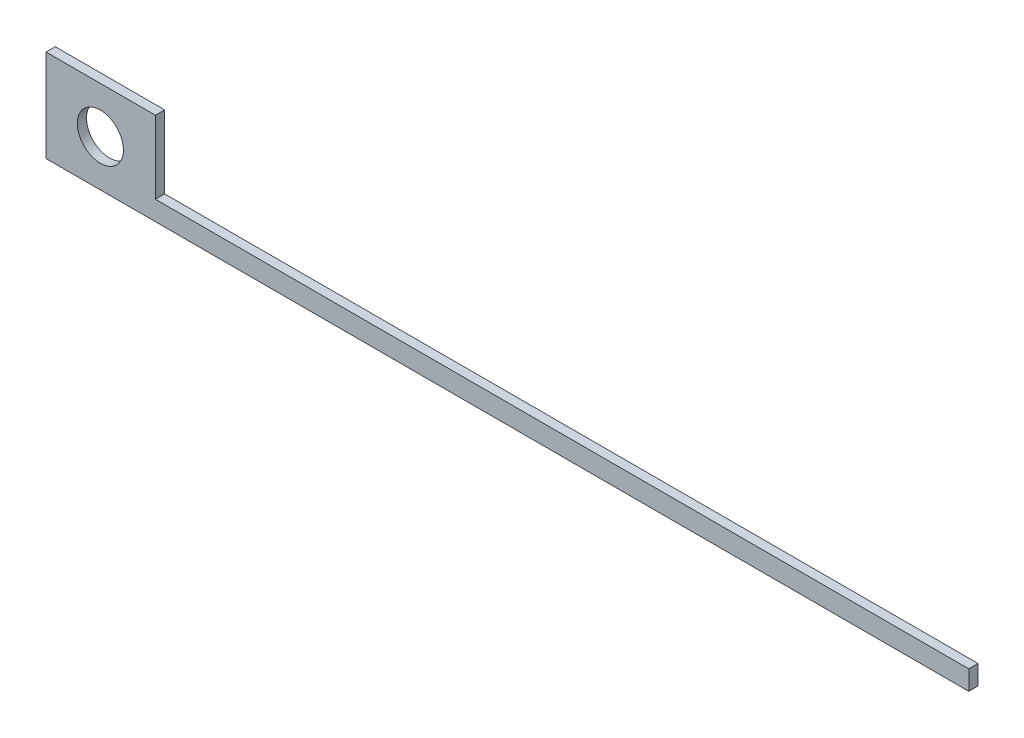
ISO-10303-21;
HEADER;
FILE_DESCRIPTION(('STEP AP214'),'2;1');
FILE_NAME('part.step','',(''),(''),'','','');
FILE_SCHEMA(('AUTOMOTIVE_DESIGN { 1 0 10303 214 1 1 1 1 }'));
ENDSEC;
DATA;
#1=APPLICATION_CONTEXT('core data for automotive mechanical design processes');
#2=APPLICATION_PROTOCOL_DEFINITION('international standard','automotive_design',2000,#1);
#3=PRODUCT_CONTEXT('',#1,'mechanical');
#4=PRODUCT('Part','Part','',(#3));
#5=PRODUCT_RELATED_PRODUCT_CATEGORY('part','',(#4));
#6=PRODUCT_DEFINITION_FORMATION('','',#4);
#7=PRODUCT_DEFINITION_CONTEXT('part definition',#1,'design');
#8=PRODUCT_DEFINITION('design','',#6,#7);
#9=PRODUCT_DEFINITION_SHAPE('','',#8);
#10=(LENGTH_UNIT() NAMED_UNIT(*) SI_UNIT(.MILLI.,.METRE.));
#11=(NAMED_UNIT(*) PLANE_ANGLE_UNIT() SI_UNIT($,.RADIAN.));
#12=(NAMED_UNIT(*) SI_UNIT($,.STERADIAN.) SOLID_ANGLE_UNIT());
#13=UNCERTAINTY_MEASURE_WITH_UNIT(LENGTH_MEASURE(1.E-05),#10,'distance_accuracy_value','');
#14=(GEOMETRIC_REPRESENTATION_CONTEXT(3) GLOBAL_UNCERTAINTY_ASSIGNED_CONTEXT((#13)) GLOBAL_UNIT_ASSIGNED_CONTEXT((#10,
#11,#12)) REPRESENTATION_CONTEXT('',''));
#15=CARTESIAN_POINT('',(0.,0.,0.));
#16=DIRECTION('',(0.,0.,1.));
#17=DIRECTION('',(1.,0.,0.));
#18=AXIS2_PLACEMENT_3D('',#15,#16,#17);
#19=CARTESIAN_POINT('',(500.000000000001,-50.,10.));
#20=DIRECTION('',(-1.,0.,0.));
#21=DIRECTION('',(0.,0.,1.));
#22=AXIS2_PLACEMENT_3D('',#19,#20,#21);
#23=PLANE('',#22);
#24=DIRECTION('',(0.,1.,0.));
#25=VECTOR('',#24,1.);
#26=CARTESIAN_POINT('',(500.000000000001,-50.,0.));
#27=LINE('',#26,#25);
#28=CARTESIAN_POINT('',(500.000000000001,-50.,0.));
#29=VERTEX_POINT('',#28);
#30=CARTESIAN_POINT('',(500.000000000001,-28.8706291572141,0.));
#31=VERTEX_POINT('',#30);
#32=EDGE_CURVE('E126',#29,#31,#27,.T.);
#33=ORIENTED_EDGE('',*,*,#32,.T.);
#34=DIRECTION('',(0.,0.,1.));
#35=VECTOR('',#34,1.);
#36=CARTESIAN_POINT('',(500.000000000001,-28.8706291572141,0.));
#37=LINE('',#36,#35);
#38=CARTESIAN_POINT('',(500.000000000001,-28.8706291572141,10.));
#39=VERTEX_POINT('',#38);
#40=EDGE_CURVE('E47',#31,#39,#37,.T.);
#41=ORIENTED_EDGE('',*,*,#40,.T.);
#42=DIRECTION('',(0.,1.,0.));
#43=VECTOR('',#42,1.);
#44=CARTESIAN_POINT('',(500.000000000001,-50.,10.));
#45=LINE('',#44,#43);
#46=CARTESIAN_POINT('',(500.000000000001,-50.,10.));
#47=VERTEX_POINT('',#46);
#48=EDGE_CURVE('E129',#47,#39,#45,.T.);
#49=ORIENTED_EDGE('',*,*,#48,.F.);
#50=DIRECTION('',(0.,0.,-1.));
#51=VECTOR('',#50,1.);
#52=CARTESIAN_POINT('',(500.000000000001,-50.,10.));
#53=LINE('',#52,#51);
#54=EDGE_CURVE('E135',#47,#29,#53,.T.);
#55=ORIENTED_EDGE('',*,*,#54,.T.);
#56=EDGE_LOOP('',(#33,#41,#49,#55));
#57=FACE_BOUND('',#56,.T.);
#58=ADVANCED_FACE('F33',(#57),#23,.F.);
#59=CARTESIAN_POINT('',(-499.999999999999,49.9999999999999,10.));
#60=DIRECTION('',(0.,-1.,0.));
#61=DIRECTION('',(0.,0.,-1.));
#62=AXIS2_PLACEMENT_3D('',#59,#60,#61);
#63=PLANE('',#62);
#64=DIRECTION('',(-1.,0.,0.));
#65=VECTOR('',#64,1.);
#66=CARTESIAN_POINT('',(-499.999999999999,49.9999999999999,10.));
#67=LINE('',#66,#65);
#68=CARTESIAN_POINT('',(-381.396206234774,49.9999999999999,10.));
#69=VERTEX_POINT('',#68);
#70=CARTESIAN_POINT('',(-499.999999999999,49.9999999999999,10.));
#71=VERTEX_POINT('',#70);
#72=EDGE_CURVE('E78',#69,#71,#67,.T.);
#73=ORIENTED_EDGE('',*,*,#72,.F.);
#74=DIRECTION('',(0.,0.,1.));
#75=VECTOR('',#74,1.);
#76=CARTESIAN_POINT('',(-381.396206234774,49.9999999999999,0.));
#77=LINE('',#76,#75);
#78=CARTESIAN_POINT('',(-381.396206234774,49.9999999999999,0.));
#79=VERTEX_POINT('',#78);
#80=EDGE_CURVE('E119',#79,#69,#77,.T.);
#81=ORIENTED_EDGE('',*,*,#80,.F.);
#82=DIRECTION('',(-1.,0.,0.));
#83=VECTOR('',#82,1.);
#84=CARTESIAN_POINT('',(-499.999999999999,49.9999999999999,0.));
#85=LINE('',#84,#83);
#86=CARTESIAN_POINT('',(-499.999999999999,49.9999999999999,0.));
#87=VERTEX_POINT('',#86);
#88=EDGE_CURVE('E113',#79,#87,#85,.T.);
#89=ORIENTED_EDGE('',*,*,#88,.T.);
#90=DIRECTION('',(0.,0.,-1.));
#91=VECTOR('',#90,1.);
#92=CARTESIAN_POINT('',(-499.999999999999,49.9999999999999,10.));
#93=LINE('',#92,#91);
#94=EDGE_CURVE('E11',#71,#87,#93,.T.);
#95=ORIENTED_EDGE('',*,*,#94,.F.);
#96=EDGE_LOOP('',(#73,#81,#89,#95));
#97=FACE_BOUND('',#96,.T.);
#98=ADVANCED_FACE('F149',(#97),#63,.F.);
#99=CARTESIAN_POINT('',(-499.999999999999,-50.,10.));
#100=DIRECTION('',(1.,0.,0.));
#101=DIRECTION('',(0.,0.,-1.));
#102=AXIS2_PLACEMENT_3D('',#99,#100,#101);
#103=PLANE('',#102);
#104=DIRECTION('',(0.,-1.,0.));
#105=VECTOR('',#104,1.);
#106=CARTESIAN_POINT('',(-499.999999999999,-50.,0.));
#107=LINE('',#106,#105);
#108=CARTESIAN_POINT('',(-499.999999999999,-50.,0.));
#109=VERTEX_POINT('',#108);
#110=EDGE_CURVE('E138',#87,#109,#107,.T.);
#111=ORIENTED_EDGE('',*,*,#110,.T.);
#112=DIRECTION('',(0.,0.,-1.));
#113=VECTOR('',#112,1.);
#114=CARTESIAN_POINT('',(-499.999999999999,-50.,10.));
#115=LINE('',#114,#113);
#116=CARTESIAN_POINT('',(-499.999999999999,-50.,10.));
#117=VERTEX_POINT('',#116);
#118=EDGE_CURVE('E40',#117,#109,#115,.T.);
#119=ORIENTED_EDGE('',*,*,#118,.F.);
#120=DIRECTION('',(0.,-1.,0.));
#121=VECTOR('',#120,1.);
#122=CARTESIAN_POINT('',(-499.999999999999,-50.,10.));
#123=LINE('',#122,#121);
#124=EDGE_CURVE('E132',#71,#117,#123,.T.);
#125=ORIENTED_EDGE('',*,*,#124,.F.);
#126=ORIENTED_EDGE('',*,*,#94,.T.);
#127=EDGE_LOOP('',(#111,#119,#125,#126));
#128=FACE_BOUND('',#127,.T.);
#129=ADVANCED_FACE('F150',(#128),#103,.F.);
#130=CARTESIAN_POINT('',(-499.999999999999,-50.,10.));
#131=DIRECTION('',(0.,1.,0.));
#132=DIRECTION('',(0.,0.,1.));
#133=AXIS2_PLACEMENT_3D('',#130,#131,#132);
#134=PLANE('',#133);
#135=DIRECTION('',(1.,0.,0.));
#136=VECTOR('',#135,1.);
#137=CARTESIAN_POINT('',(-499.999999999999,-50.,0.));
#138=LINE('',#137,#136);
#139=EDGE_CURVE('E73',#109,#29,#138,.T.);
#140=ORIENTED_EDGE('',*,*,#139,.T.);
#141=ORIENTED_EDGE('',*,*,#54,.F.);
#142=DIRECTION('',(1.,0.,0.));
#143=VECTOR('',#142,1.);
#144=CARTESIAN_POINT('',(-499.999999999999,-50.,10.));
#145=LINE('',#144,#143);
#146=EDGE_CURVE('E56',#117,#47,#145,.T.);
#147=ORIENTED_EDGE('',*,*,#146,.F.);
#148=ORIENTED_EDGE('',*,*,#118,.T.);
#149=EDGE_LOOP('',(#140,#141,#147,#148));
#150=FACE_BOUND('',#149,.T.);
#151=ADVANCED_FACE('F142',(#150),#134,.F.);
#152=CARTESIAN_POINT('',(0.,0.,10.));
#153=DIRECTION('',(0.,0.,-1.));
#154=DIRECTION('',(-1.,0.,0.));
#155=AXIS2_PLACEMENT_3D('',#152,#153,#154);
#156=PLANE('',#155);
#157=CARTESIAN_POINT('',(-441.10987675461,0.,10.));
#158=DIRECTION('',(0.,0.,1.));
#159=DIRECTION('',(1.,0.,0.));
#160=AXIS2_PLACEMENT_3D('',#157,#158,#159);
#161=CIRCLE('',#160,25.);
#162=CARTESIAN_POINT('',(-416.10987675461,0.,10.));
#163=VERTEX_POINT('',#162);
#164=EDGE_CURVE('E121',#163,#163,#161,.T.);
#165=ORIENTED_EDGE('',*,*,#164,.F.);
#166=EDGE_LOOP('',(#165));
#167=FACE_BOUND('',#166,.T.);
#168=DIRECTION('',(1.,0.,0.));
#169=VECTOR('',#168,1.);
#170=CARTESIAN_POINT('',(-381.396206234774,-28.8706291572141,10.));
#171=LINE('',#170,#169);
#172=CARTESIAN_POINT('',(-381.396206234774,-28.8706291572141,10.));
#173=VERTEX_POINT('',#172);
#174=EDGE_CURVE('E114',#173,#39,#171,.T.);
#175=ORIENTED_EDGE('',*,*,#174,.F.);
#176=DIRECTION('',(0.,-1.,0.));
#177=VECTOR('',#176,1.);
#178=CARTESIAN_POINT('',(-381.396206234774,49.9999999999999,10.));
#179=LINE('',#178,#177);
#180=EDGE_CURVE('E100',#69,#173,#179,.T.);
#181=ORIENTED_EDGE('',*,*,#180,.F.);
#182=ORIENTED_EDGE('',*,*,#72,.T.);
#183=ORIENTED_EDGE('',*,*,#124,.T.);
#184=ORIENTED_EDGE('',*,*,#146,.T.);
#185=ORIENTED_EDGE('',*,*,#48,.T.);
#186=EDGE_LOOP('',(#175,#181,#182,#183,#184,#185));
#187=FACE_BOUND('',#186,.T.);
#188=ADVANCED_FACE('F147',(#167,#187),#156,.F.);
#189=CARTESIAN_POINT('',(0.,0.,0.));
#190=DIRECTION('',(0.,0.,-1.));
#191=DIRECTION('',(-1.,0.,0.));
#192=AXIS2_PLACEMENT_3D('',#189,#190,#191);
#193=PLANE('',#192);
#194=DIRECTION('',(0.,-1.,0.));
#195=VECTOR('',#194,1.);
#196=CARTESIAN_POINT('',(-381.396206234774,49.9999999999999,0.));
#197=LINE('',#196,#195);
#198=CARTESIAN_POINT('',(-381.396206234774,-28.8706291572141,0.));
#199=VERTEX_POINT('',#198);
#200=EDGE_CURVE('E98',#79,#199,#197,.T.);
#201=ORIENTED_EDGE('',*,*,#200,.T.);
#202=DIRECTION('',(1.,0.,0.));
#203=VECTOR('',#202,1.);
#204=CARTESIAN_POINT('',(-381.396206234774,-28.8706291572141,0.));
#205=LINE('',#204,#203);
#206=EDGE_CURVE('E102',#199,#31,#205,.T.);
#207=ORIENTED_EDGE('',*,*,#206,.T.);
#208=ORIENTED_EDGE('',*,*,#32,.F.);
#209=ORIENTED_EDGE('',*,*,#139,.F.);
#210=ORIENTED_EDGE('',*,*,#110,.F.);
#211=ORIENTED_EDGE('',*,*,#88,.F.);
#212=EDGE_LOOP('',(#201,#207,#208,#209,#210,#211));
#213=FACE_BOUND('',#212,.T.);
#214=CARTESIAN_POINT('',(-441.10987675461,0.,0.));
#215=DIRECTION('',(0.,0.,1.));
#216=DIRECTION('',(1.,0.,0.));
#217=AXIS2_PLACEMENT_3D('',#214,#215,#216);
#218=CIRCLE('',#217,25.);
#219=CARTESIAN_POINT('',(-416.10987675461,0.,0.));
#220=VERTEX_POINT('',#219);
#221=EDGE_CURVE('E123',#220,#220,#218,.T.);
#222=ORIENTED_EDGE('',*,*,#221,.T.);
#223=EDGE_LOOP('',(#222));
#224=FACE_BOUND('',#223,.T.);
#225=ADVANCED_FACE('F110',(#213,#224),#193,.T.);
#226=CARTESIAN_POINT('',(-441.10987675461,0.,0.));
#227=DIRECTION('',(0.,0.,1.));
#228=DIRECTION('',(1.,0.,0.));
#229=AXIS2_PLACEMENT_3D('',#226,#227,#228);
#230=CYLINDRICAL_SURFACE('',#229,25.);
#231=ORIENTED_EDGE('',*,*,#221,.F.);
#232=EDGE_LOOP('',(#231));
#233=FACE_BOUND('',#232,.T.);
#234=ORIENTED_EDGE('',*,*,#164,.T.);
#235=EDGE_LOOP('',(#234));
#236=FACE_BOUND('',#235,.T.);
#237=ADVANCED_FACE('F186',(#233,#236),#230,.F.);
#238=CARTESIAN_POINT('',(-381.396206234774,49.9999999999999,0.));
#239=DIRECTION('',(-1.,0.,0.));
#240=DIRECTION('',(0.,0.,1.));
#241=AXIS2_PLACEMENT_3D('',#238,#239,#240);
#242=PLANE('',#241);
#243=ORIENTED_EDGE('',*,*,#180,.T.);
#244=DIRECTION('',(0.,0.,1.));
#245=VECTOR('',#244,1.);
#246=CARTESIAN_POINT('',(-381.396206234774,-28.8706291572141,0.));
#247=LINE('',#246,#245);
#248=EDGE_CURVE('E95',#199,#173,#247,.T.);
#249=ORIENTED_EDGE('',*,*,#248,.F.);
#250=ORIENTED_EDGE('',*,*,#200,.F.);
#251=ORIENTED_EDGE('',*,*,#80,.T.);
#252=EDGE_LOOP('',(#243,#249,#250,#251));
#253=FACE_BOUND('',#252,.T.);
#254=ADVANCED_FACE('F96',(#253),#242,.F.);
#255=CARTESIAN_POINT('',(-381.396206234774,-28.8706291572141,0.));
#256=DIRECTION('',(0.,-1.,0.));
#257=DIRECTION('',(0.,0.,-1.));
#258=AXIS2_PLACEMENT_3D('',#255,#256,#257);
#259=PLANE('',#258);
#260=ORIENTED_EDGE('',*,*,#174,.T.);
#261=ORIENTED_EDGE('',*,*,#40,.F.);
#262=ORIENTED_EDGE('',*,*,#206,.F.);
#263=ORIENTED_EDGE('',*,*,#248,.T.);
#264=EDGE_LOOP('',(#260,#261,#262,#263));
#265=FACE_BOUND('',#264,.T.);
#266=ADVANCED_FACE('F104',(#265),#259,.F.);
#267=CLOSED_SHELL('',(#58,#98,#129,#151,#188,#225,#237,#254,#266));
#268=MANIFOLD_SOLID_BREP('B2',#267);
#269=ADVANCED_BREP_SHAPE_REPRESENTATION('',(#18,#268),#14);
#270=SHAPE_DEFINITION_REPRESENTATION(#9,#269);
ENDSEC;
END-ISO-10303-21;
